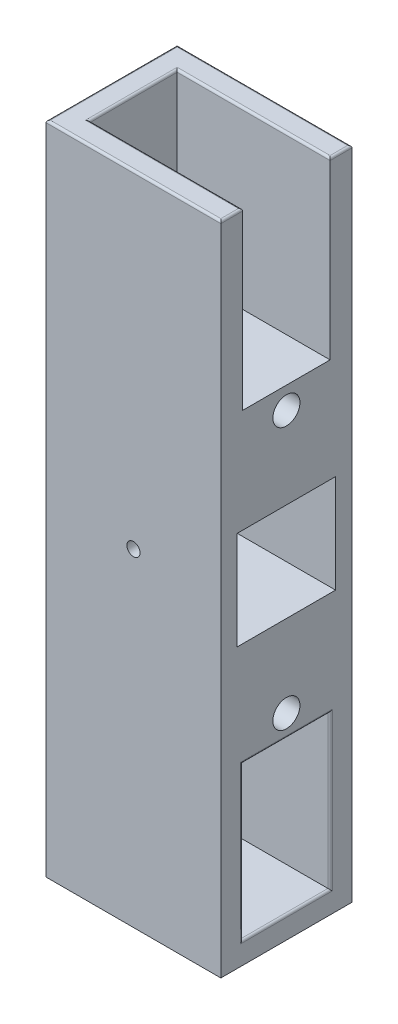
ISO-10303-21;
HEADER;
FILE_DESCRIPTION(('STEP AP214'),'2;1');
FILE_NAME('part.step','',(''),(''),'','','');
FILE_SCHEMA(('AUTOMOTIVE_DESIGN { 1 0 10303 214 1 1 1 1 }'));
ENDSEC;
DATA;
#1=APPLICATION_CONTEXT('core data for automotive mechanical design processes');
#2=APPLICATION_PROTOCOL_DEFINITION('international standard','automotive_design',2000,#1);
#3=PRODUCT_CONTEXT('',#1,'mechanical');
#4=PRODUCT('Part','Part','',(#3));
#5=PRODUCT_RELATED_PRODUCT_CATEGORY('part','',(#4));
#6=PRODUCT_DEFINITION_FORMATION('','',#4);
#7=PRODUCT_DEFINITION_CONTEXT('part definition',#1,'design');
#8=PRODUCT_DEFINITION('design','',#6,#7);
#9=PRODUCT_DEFINITION_SHAPE('','',#8);
#10=(LENGTH_UNIT() NAMED_UNIT(*) SI_UNIT(.MILLI.,.METRE.));
#11=(NAMED_UNIT(*) PLANE_ANGLE_UNIT() SI_UNIT($,.RADIAN.));
#12=(NAMED_UNIT(*) SI_UNIT($,.STERADIAN.) SOLID_ANGLE_UNIT());
#13=UNCERTAINTY_MEASURE_WITH_UNIT(LENGTH_MEASURE(1.E-05),#10,'distance_accuracy_value','');
#14=(GEOMETRIC_REPRESENTATION_CONTEXT(3) GLOBAL_UNCERTAINTY_ASSIGNED_CONTEXT((#13)) GLOBAL_UNIT_ASSIGNED_CONTEXT((#10,
#11,#12)) REPRESENTATION_CONTEXT('',''));
#15=CARTESIAN_POINT('',(0.,0.,0.));
#16=DIRECTION('',(0.,0.,1.));
#17=DIRECTION('',(1.,0.,0.));
#18=AXIS2_PLACEMENT_3D('',#15,#16,#17);
#19=CARTESIAN_POINT('',(20.,-75.,-15.));
#20=DIRECTION('',(1.,0.,0.));
#21=DIRECTION('',(0.,0.,-1.));
#22=AXIS2_PLACEMENT_3D('',#19,#20,#21);
#23=PLANE('',#22);
#24=DIRECTION('',(0.,1.,0.));
#25=VECTOR('',#24,1.);
#26=CARTESIAN_POINT('',(20.,-70.,-10.5));
#27=LINE('',#26,#25);
#28=CARTESIAN_POINT('',(20.,-34.5,-10.5));
#29=VERTEX_POINT('',#28);
#30=CARTESIAN_POINT('',(20.,-70.5,-10.5));
#31=VERTEX_POINT('',#30);
#32=EDGE_CURVE('E441',#29,#31,#27,.F.);
#33=ORIENTED_EDGE('',*,*,#32,.T.);
#34=DIRECTION('',(0.,0.,-1.));
#35=VECTOR('',#34,1.);
#36=CARTESIAN_POINT('',(20.,-70.5,10.));
#37=LINE('',#36,#35);
#38=CARTESIAN_POINT('',(20.,-70.5,10.5));
#39=VERTEX_POINT('',#38);
#40=EDGE_CURVE('E450',#31,#39,#37,.F.);
#41=ORIENTED_EDGE('',*,*,#40,.T.);
#42=DIRECTION('',(0.,-1.,0.));
#43=VECTOR('',#42,1.);
#44=CARTESIAN_POINT('',(20.,-35.,10.5));
#45=LINE('',#44,#43);
#46=CARTESIAN_POINT('',(20.,-34.5,10.5));
#47=VERTEX_POINT('',#46);
#48=EDGE_CURVE('E447',#39,#47,#45,.F.);
#49=ORIENTED_EDGE('',*,*,#48,.T.);
#50=DIRECTION('',(0.,0.,1.));
#51=VECTOR('',#50,1.);
#52=CARTESIAN_POINT('',(20.,-34.5,-10.));
#53=LINE('',#52,#51);
#54=EDGE_CURVE('E444',#47,#29,#53,.F.);
#55=ORIENTED_EDGE('',*,*,#54,.T.);
#56=EDGE_LOOP('',(#33,#41,#49,#55));
#57=FACE_BOUND('',#56,.T.);
#58=DIRECTION('',(0.,1.,0.));
#59=VECTOR('',#58,1.);
#60=CARTESIAN_POINT('',(20.,-75.,-15.));
#61=LINE('',#60,#59);
#62=CARTESIAN_POINT('',(20.,-75.,-15.));
#63=VERTEX_POINT('',#62);
#64=CARTESIAN_POINT('',(20.,74.5,-15.));
#65=VERTEX_POINT('',#64);
#66=EDGE_CURVE('E321',#63,#65,#61,.T.);
#67=ORIENTED_EDGE('',*,*,#66,.T.);
#68=DIRECTION('',(0.,0.,-1.));
#69=VECTOR('',#68,1.);
#70=CARTESIAN_POINT('',(20.,74.5,-15.));
#71=LINE('',#70,#69);
#72=CARTESIAN_POINT('',(20.,74.5,-10.));
#73=VERTEX_POINT('',#72);
#74=EDGE_CURVE('E390',#65,#73,#71,.F.);
#75=ORIENTED_EDGE('',*,*,#74,.T.);
#76=DIRECTION('',(0.,1.,0.));
#77=VECTOR('',#76,1.);
#78=CARTESIAN_POINT('',(20.,-75.,-10.));
#79=LINE('',#78,#77);
#80=CARTESIAN_POINT('',(20.,35.,-10.));
#81=VERTEX_POINT('',#80);
#82=EDGE_CURVE('E260',#81,#73,#79,.T.);
#83=ORIENTED_EDGE('',*,*,#82,.F.);
#84=DIRECTION('',(0.,0.,-1.));
#85=VECTOR('',#84,1.);
#86=CARTESIAN_POINT('',(20.,35.,-15.));
#87=LINE('',#86,#85);
#88=CARTESIAN_POINT('',(20.,35.,10.));
#89=VERTEX_POINT('',#88);
#90=EDGE_CURVE('E359',#89,#81,#87,.T.);
#91=ORIENTED_EDGE('',*,*,#90,.F.);
#92=DIRECTION('',(0.,-1.,0.));
#93=VECTOR('',#92,1.);
#94=CARTESIAN_POINT('',(20.,-75.,10.));
#95=LINE('',#94,#93);
#96=CARTESIAN_POINT('',(20.,74.5,10.));
#97=VERTEX_POINT('',#96);
#98=EDGE_CURVE('E254',#97,#89,#95,.T.);
#99=ORIENTED_EDGE('',*,*,#98,.F.);
#100=DIRECTION('',(0.,0.,-1.));
#101=VECTOR('',#100,1.);
#102=CARTESIAN_POINT('',(20.,74.5,-15.));
#103=LINE('',#102,#101);
#104=CARTESIAN_POINT('',(20.,74.5,15.));
#105=VERTEX_POINT('',#104);
#106=EDGE_CURVE('E387',#97,#105,#103,.F.);
#107=ORIENTED_EDGE('',*,*,#106,.T.);
#108=DIRECTION('',(0.,1.,0.));
#109=VECTOR('',#108,1.);
#110=CARTESIAN_POINT('',(20.,-75.,15.));
#111=LINE('',#110,#109);
#112=CARTESIAN_POINT('',(20.,-75.,15.));
#113=VERTEX_POINT('',#112);
#114=EDGE_CURVE('E322',#113,#105,#111,.T.);
#115=ORIENTED_EDGE('',*,*,#114,.F.);
#116=DIRECTION('',(0.,0.,-1.));
#117=VECTOR('',#116,1.);
#118=CARTESIAN_POINT('',(20.,-75.,-15.));
#119=LINE('',#118,#117);
#120=EDGE_CURVE('E305',#113,#63,#119,.T.);
#121=ORIENTED_EDGE('',*,*,#120,.T.);
#122=EDGE_LOOP('',(#67,#75,#83,#91,#99,#107,#115,#121));
#123=FACE_BOUND('',#122,.T.);
#124=CARTESIAN_POINT('',(20.,-30.,0.));
#125=DIRECTION('',(-1.,0.,0.));
#126=DIRECTION('',(0.,0.,-1.));
#127=AXIS2_PLACEMENT_3D('',#124,#125,#126);
#128=CIRCLE('',#127,3.1);
#129=CARTESIAN_POINT('',(20.,-30.,-3.1));
#130=VERTEX_POINT('',#129);
#131=EDGE_CURVE('E295',#130,#130,#128,.T.);
#132=ORIENTED_EDGE('',*,*,#131,.T.);
#133=EDGE_LOOP('',(#132));
#134=FACE_BOUND('',#133,.T.);
#135=CARTESIAN_POINT('',(20.,30.,0.));
#136=DIRECTION('',(1.,0.,0.));
#137=DIRECTION('',(0.,0.,-1.));
#138=AXIS2_PLACEMENT_3D('',#135,#136,#137);
#139=CIRCLE('',#138,3.1);
#140=CARTESIAN_POINT('',(20.,30.,-3.1));
#141=VERTEX_POINT('',#140);
#142=EDGE_CURVE('E300',#141,#141,#139,.T.);
#143=ORIENTED_EDGE('',*,*,#142,.F.);
#144=EDGE_LOOP('',(#143));
#145=FACE_BOUND('',#144,.T.);
#146=DIRECTION('',(0.,0.,-1.));
#147=VECTOR('',#146,1.);
#148=CARTESIAN_POINT('',(20.,11.25,-15.));
#149=LINE('',#148,#147);
#150=CARTESIAN_POINT('',(20.,11.25,11.25));
#151=VERTEX_POINT('',#150);
#152=CARTESIAN_POINT('',(20.,11.25,-11.25));
#153=VERTEX_POINT('',#152);
#154=EDGE_CURVE('E287',#151,#153,#149,.T.);
#155=ORIENTED_EDGE('',*,*,#154,.T.);
#156=DIRECTION('',(0.,-1.,0.));
#157=VECTOR('',#156,1.);
#158=CARTESIAN_POINT('',(20.,-75.,-11.25));
#159=LINE('',#158,#157);
#160=CARTESIAN_POINT('',(20.,-11.25,-11.25));
#161=VERTEX_POINT('',#160);
#162=EDGE_CURVE('E291',#153,#161,#159,.T.);
#163=ORIENTED_EDGE('',*,*,#162,.T.);
#164=DIRECTION('',(0.,0.,1.));
#165=VECTOR('',#164,1.);
#166=CARTESIAN_POINT('',(20.,-11.25,-15.));
#167=LINE('',#166,#165);
#168=CARTESIAN_POINT('',(20.,-11.25,11.25));
#169=VERTEX_POINT('',#168);
#170=EDGE_CURVE('E279',#161,#169,#167,.T.);
#171=ORIENTED_EDGE('',*,*,#170,.T.);
#172=DIRECTION('',(0.,1.,0.));
#173=VECTOR('',#172,1.);
#174=CARTESIAN_POINT('',(20.,-75.,11.25));
#175=LINE('',#174,#173);
#176=EDGE_CURVE('E283',#169,#151,#175,.T.);
#177=ORIENTED_EDGE('',*,*,#176,.T.);
#178=EDGE_LOOP('',(#155,#163,#171,#177));
#179=FACE_BOUND('',#178,.T.);
#180=ADVANCED_FACE('F39',(#57,#123,#134,#145,#179),#23,.T.);
#181=CARTESIAN_POINT('',(-20.,-75.,-15.));
#182=DIRECTION('',(-1.,0.,0.));
#183=DIRECTION('',(0.,0.,1.));
#184=AXIS2_PLACEMENT_3D('',#181,#182,#183);
#185=PLANE('',#184);
#186=CARTESIAN_POINT('',(-20.,-30.,0.));
#187=DIRECTION('',(-1.,0.,0.));
#188=DIRECTION('',(0.,0.,1.));
#189=AXIS2_PLACEMENT_3D('',#186,#187,#188);
#190=CIRCLE('',#189,3.1);
#191=CARTESIAN_POINT('',(-20.,-30.,3.1));
#192=VERTEX_POINT('',#191);
#193=EDGE_CURVE('E299',#192,#192,#190,.F.);
#194=ORIENTED_EDGE('',*,*,#193,.T.);
#195=EDGE_LOOP('',(#194));
#196=FACE_BOUND('',#195,.T.);
#197=CARTESIAN_POINT('',(-20.,30.,0.));
#198=DIRECTION('',(-1.,0.,0.));
#199=DIRECTION('',(0.,0.,1.));
#200=AXIS2_PLACEMENT_3D('',#197,#198,#199);
#201=CIRCLE('',#200,3.1);
#202=CARTESIAN_POINT('',(-20.,30.,3.1));
#203=VERTEX_POINT('',#202);
#204=EDGE_CURVE('E304',#203,#203,#201,.T.);
#205=ORIENTED_EDGE('',*,*,#204,.F.);
#206=EDGE_LOOP('',(#205));
#207=FACE_BOUND('',#206,.T.);
#208=DIRECTION('',(0.,1.,0.));
#209=VECTOR('',#208,1.);
#210=CARTESIAN_POINT('',(-20.,-75.,15.));
#211=LINE('',#210,#209);
#212=CARTESIAN_POINT('',(-20.,-75.,15.));
#213=VERTEX_POINT('',#212);
#214=CARTESIAN_POINT('',(-20.,74.5,15.));
#215=VERTEX_POINT('',#214);
#216=EDGE_CURVE('E327',#213,#215,#211,.T.);
#217=ORIENTED_EDGE('',*,*,#216,.T.);
#218=DIRECTION('',(0.,0.,1.));
#219=VECTOR('',#218,1.);
#220=CARTESIAN_POINT('',(-20.,74.5,-15.));
#221=LINE('',#220,#219);
#222=CARTESIAN_POINT('',(-20.,74.5,-15.));
#223=VERTEX_POINT('',#222);
#224=EDGE_CURVE('E406',#215,#223,#221,.F.);
#225=ORIENTED_EDGE('',*,*,#224,.T.);
#226=DIRECTION('',(0.,1.,0.));
#227=VECTOR('',#226,1.);
#228=CARTESIAN_POINT('',(-20.,-75.,-15.));
#229=LINE('',#228,#227);
#230=CARTESIAN_POINT('',(-20.,-75.,-15.));
#231=VERTEX_POINT('',#230);
#232=EDGE_CURVE('E331',#231,#223,#229,.T.);
#233=ORIENTED_EDGE('',*,*,#232,.F.);
#234=DIRECTION('',(0.,0.,1.));
#235=VECTOR('',#234,1.);
#236=CARTESIAN_POINT('',(-20.,-75.,-15.));
#237=LINE('',#236,#235);
#238=EDGE_CURVE('E313',#231,#213,#237,.T.);
#239=ORIENTED_EDGE('',*,*,#238,.T.);
#240=EDGE_LOOP('',(#217,#225,#233,#239));
#241=FACE_BOUND('',#240,.T.);
#242=DIRECTION('',(0.,0.,-1.));
#243=VECTOR('',#242,1.);
#244=CARTESIAN_POINT('',(-20.,-11.25,-15.));
#245=LINE('',#244,#243);
#246=CARTESIAN_POINT('',(-20.,-11.25,11.25));
#247=VERTEX_POINT('',#246);
#248=CARTESIAN_POINT('',(-20.,-11.25,-11.25));
#249=VERTEX_POINT('',#248);
#250=EDGE_CURVE('E326',#247,#249,#245,.T.);
#251=ORIENTED_EDGE('',*,*,#250,.T.);
#252=DIRECTION('',(0.,1.,0.));
#253=VECTOR('',#252,1.);
#254=CARTESIAN_POINT('',(-20.,-75.,-11.25));
#255=LINE('',#254,#253);
#256=CARTESIAN_POINT('',(-20.,11.25,-11.25));
#257=VERTEX_POINT('',#256);
#258=EDGE_CURVE('E355',#249,#257,#255,.T.);
#259=ORIENTED_EDGE('',*,*,#258,.T.);
#260=DIRECTION('',(0.,0.,1.));
#261=VECTOR('',#260,1.);
#262=CARTESIAN_POINT('',(-20.,11.25,-15.));
#263=LINE('',#262,#261);
#264=CARTESIAN_POINT('',(-20.,11.25,11.25));
#265=VERTEX_POINT('',#264);
#266=EDGE_CURVE('E351',#257,#265,#263,.T.);
#267=ORIENTED_EDGE('',*,*,#266,.T.);
#268=DIRECTION('',(0.,-1.,0.));
#269=VECTOR('',#268,1.);
#270=CARTESIAN_POINT('',(-20.,-75.,11.25));
#271=LINE('',#270,#269);
#272=EDGE_CURVE('E347',#265,#247,#271,.T.);
#273=ORIENTED_EDGE('',*,*,#272,.T.);
#274=EDGE_LOOP('',(#251,#259,#267,#273));
#275=FACE_BOUND('',#274,.T.);
#276=ADVANCED_FACE('F499',(#196,#207,#241,#275),#185,.T.);
#277=CARTESIAN_POINT('',(-20.,-75.,15.));
#278=DIRECTION('',(0.,0.,1.));
#279=DIRECTION('',(1.,0.,0.));
#280=AXIS2_PLACEMENT_3D('',#277,#278,#279);
#281=PLANE('',#280);
#282=CARTESIAN_POINT('',(0.,0.,15.));
#283=DIRECTION('',(0.,0.,1.));
#284=DIRECTION('',(1.,0.,0.));
#285=AXIS2_PLACEMENT_3D('',#282,#283,#284);
#286=CIRCLE('',#285,1.5);
#287=CARTESIAN_POINT('',(1.5,0.,15.));
#288=VERTEX_POINT('',#287);
#289=EDGE_CURVE('E223',#288,#288,#286,.F.);
#290=ORIENTED_EDGE('',*,*,#289,.T.);
#291=EDGE_LOOP('',(#290));
#292=FACE_BOUND('',#291,.T.);
#293=ORIENTED_EDGE('',*,*,#114,.T.);
#294=DIRECTION('',(1.,0.,0.));
#295=VECTOR('',#294,1.);
#296=CARTESIAN_POINT('',(-20.,74.5,15.));
#297=LINE('',#296,#295);
#298=EDGE_CURVE('E409',#105,#215,#297,.F.);
#299=ORIENTED_EDGE('',*,*,#298,.T.);
#300=ORIENTED_EDGE('',*,*,#216,.F.);
#301=DIRECTION('',(1.,0.,0.));
#302=VECTOR('',#301,1.);
#303=CARTESIAN_POINT('',(-20.,-75.,15.));
#304=LINE('',#303,#302);
#305=EDGE_CURVE('E317',#213,#113,#304,.T.);
#306=ORIENTED_EDGE('',*,*,#305,.T.);
#307=EDGE_LOOP('',(#293,#299,#300,#306));
#308=FACE_BOUND('',#307,.T.);
#309=ADVANCED_FACE('F504',(#292,#308),#281,.T.);
#310=CARTESIAN_POINT('',(-20.,-75.,-15.));
#311=DIRECTION('',(0.,0.,-1.));
#312=DIRECTION('',(-1.,0.,0.));
#313=AXIS2_PLACEMENT_3D('',#310,#311,#312);
#314=PLANE('',#313);
#315=CARTESIAN_POINT('',(0.,0.,-15.));
#316=DIRECTION('',(0.,0.,-1.));
#317=DIRECTION('',(-1.,0.,0.));
#318=AXIS2_PLACEMENT_3D('',#315,#316,#317);
#319=CIRCLE('',#318,1.5);
#320=CARTESIAN_POINT('',(-1.5,0.,-15.));
#321=VERTEX_POINT('',#320);
#322=EDGE_CURVE('E808',#321,#321,#319,.F.);
#323=ORIENTED_EDGE('',*,*,#322,.T.);
#324=EDGE_LOOP('',(#323));
#325=FACE_BOUND('',#324,.T.);
#326=ORIENTED_EDGE('',*,*,#232,.T.);
#327=DIRECTION('',(-1.,0.,0.));
#328=VECTOR('',#327,1.);
#329=CARTESIAN_POINT('',(-20.,74.5,-15.));
#330=LINE('',#329,#328);
#331=EDGE_CURVE('E403',#223,#65,#330,.F.);
#332=ORIENTED_EDGE('',*,*,#331,.T.);
#333=ORIENTED_EDGE('',*,*,#66,.F.);
#334=DIRECTION('',(-1.,0.,0.));
#335=VECTOR('',#334,1.);
#336=CARTESIAN_POINT('',(-20.,-75.,-15.));
#337=LINE('',#336,#335);
#338=EDGE_CURVE('E309',#63,#231,#337,.T.);
#339=ORIENTED_EDGE('',*,*,#338,.T.);
#340=EDGE_LOOP('',(#326,#332,#333,#339));
#341=FACE_BOUND('',#340,.T.);
#342=ADVANCED_FACE('F509',(#325,#341),#314,.T.);
#343=CARTESIAN_POINT('',(0.,-75.,0.));
#344=DIRECTION('',(0.,1.,0.));
#345=DIRECTION('',(0.,0.,1.));
#346=AXIS2_PLACEMENT_3D('',#343,#344,#345);
#347=PLANE('',#346);
#348=ORIENTED_EDGE('',*,*,#120,.F.);
#349=ORIENTED_EDGE('',*,*,#305,.F.);
#350=ORIENTED_EDGE('',*,*,#238,.F.);
#351=ORIENTED_EDGE('',*,*,#338,.F.);
#352=EDGE_LOOP('',(#348,#349,#350,#351));
#353=FACE_BOUND('',#352,.T.);
#354=ADVANCED_FACE('F724',(#353),#347,.F.);
#355=CARTESIAN_POINT('',(0.,75.,0.));
#356=DIRECTION('',(0.,1.,0.));
#357=DIRECTION('',(0.,0.,1.));
#358=AXIS2_PLACEMENT_3D('',#355,#356,#357);
#359=PLANE('',#358);
#360=DIRECTION('',(-1.,0.,0.));
#361=VECTOR('',#360,1.);
#362=CARTESIAN_POINT('',(20.,75.,-10.5));
#363=LINE('',#362,#361);
#364=CARTESIAN_POINT('',(-15.5,75.,-10.5));
#365=VERTEX_POINT('',#364);
#366=CARTESIAN_POINT('',(19.5,75.,-10.5));
#367=VERTEX_POINT('',#366);
#368=EDGE_CURVE('E380',#365,#367,#363,.F.);
#369=ORIENTED_EDGE('',*,*,#368,.T.);
#370=DIRECTION('',(0.,0.,-1.));
#371=VECTOR('',#370,1.);
#372=CARTESIAN_POINT('',(19.5,75.,0.));
#373=LINE('',#372,#371);
#374=CARTESIAN_POINT('',(19.5,75.,-14.5));
#375=VERTEX_POINT('',#374);
#376=EDGE_CURVE('E383',#367,#375,#373,.T.);
#377=ORIENTED_EDGE('',*,*,#376,.T.);
#378=DIRECTION('',(-1.,0.,0.));
#379=VECTOR('',#378,1.);
#380=CARTESIAN_POINT('',(0.,75.,-14.5));
#381=LINE('',#380,#379);
#382=CARTESIAN_POINT('',(-19.5,75.,-14.5));
#383=VERTEX_POINT('',#382);
#384=EDGE_CURVE('E368',#375,#383,#381,.T.);
#385=ORIENTED_EDGE('',*,*,#384,.T.);
#386=DIRECTION('',(0.,0.,1.));
#387=VECTOR('',#386,1.);
#388=CARTESIAN_POINT('',(-19.5,75.,0.));
#389=LINE('',#388,#387);
#390=CARTESIAN_POINT('',(-19.5,75.,14.5));
#391=VERTEX_POINT('',#390);
#392=EDGE_CURVE('E365',#383,#391,#389,.T.);
#393=ORIENTED_EDGE('',*,*,#392,.T.);
#394=DIRECTION('',(1.,0.,0.));
#395=VECTOR('',#394,1.);
#396=CARTESIAN_POINT('',(0.,75.,14.5));
#397=LINE('',#396,#395);
#398=CARTESIAN_POINT('',(19.5,75.,14.5));
#399=VERTEX_POINT('',#398);
#400=EDGE_CURVE('E362',#391,#399,#397,.T.);
#401=ORIENTED_EDGE('',*,*,#400,.T.);
#402=DIRECTION('',(0.,0.,-1.));
#403=VECTOR('',#402,1.);
#404=CARTESIAN_POINT('',(19.5,75.,0.));
#405=LINE('',#404,#403);
#406=CARTESIAN_POINT('',(19.5,75.,10.5));
#407=VERTEX_POINT('',#406);
#408=EDGE_CURVE('E371',#399,#407,#405,.T.);
#409=ORIENTED_EDGE('',*,*,#408,.T.);
#410=DIRECTION('',(1.,0.,0.));
#411=VECTOR('',#410,1.);
#412=CARTESIAN_POINT('',(-15.,75.,10.5));
#413=LINE('',#412,#411);
#414=CARTESIAN_POINT('',(-15.5,75.,10.5));
#415=VERTEX_POINT('',#414);
#416=EDGE_CURVE('E374',#407,#415,#413,.F.);
#417=ORIENTED_EDGE('',*,*,#416,.T.);
#418=DIRECTION('',(0.,0.,1.));
#419=VECTOR('',#418,1.);
#420=CARTESIAN_POINT('',(-15.5,75.,-10.));
#421=LINE('',#420,#419);
#422=EDGE_CURVE('E377',#415,#365,#421,.F.);
#423=ORIENTED_EDGE('',*,*,#422,.T.);
#424=EDGE_LOOP('',(#369,#377,#385,#393,#401,#409,#417,#423));
#425=FACE_BOUND('',#424,.T.);
#426=ADVANCED_FACE('F716',(#425),#359,.T.);
#427=CARTESIAN_POINT('',(-130.,30.,0.));
#428=DIRECTION('',(1.,0.,0.));
#429=DIRECTION('',(0.,0.,-1.));
#430=AXIS2_PLACEMENT_3D('',#427,#428,#429);
#431=CYLINDRICAL_SURFACE('',#430,3.1);
#432=ORIENTED_EDGE('',*,*,#204,.T.);
#433=EDGE_LOOP('',(#432));
#434=FACE_BOUND('',#433,.T.);
#435=ORIENTED_EDGE('',*,*,#142,.T.);
#436=EDGE_LOOP('',(#435));
#437=FACE_BOUND('',#436,.T.);
#438=ADVANCED_FACE('F709',(#434,#437),#431,.F.);
#439=CARTESIAN_POINT('',(-130.,-30.,0.));
#440=DIRECTION('',(1.,0.,0.));
#441=DIRECTION('',(0.,0.,-1.));
#442=AXIS2_PLACEMENT_3D('',#439,#440,#441);
#443=CYLINDRICAL_SURFACE('',#442,3.1);
#444=ORIENTED_EDGE('',*,*,#193,.F.);
#445=EDGE_LOOP('',(#444));
#446=FACE_BOUND('',#445,.T.);
#447=ORIENTED_EDGE('',*,*,#131,.F.);
#448=EDGE_LOOP('',(#447));
#449=FACE_BOUND('',#448,.T.);
#450=ADVANCED_FACE('F634',(#446,#449),#443,.F.);
#451=CARTESIAN_POINT('',(150.,11.25,-11.25));
#452=DIRECTION('',(0.,0.,1.));
#453=DIRECTION('',(0.,-1.,0.));
#454=AXIS2_PLACEMENT_3D('',#451,#452,#453);
#455=PLANE('',#454);
#456=CARTESIAN_POINT('',(0.,0.,-11.25));
#457=DIRECTION('',(0.,0.,1.));
#458=DIRECTION('',(0.,-1.,0.));
#459=AXIS2_PLACEMENT_3D('',#456,#457,#458);
#460=CIRCLE('',#459,1.5);
#461=CARTESIAN_POINT('',(0.,-1.5,-11.25));
#462=VERTEX_POINT('',#461);
#463=EDGE_CURVE('E811',#462,#462,#460,.F.);
#464=ORIENTED_EDGE('',*,*,#463,.T.);
#465=EDGE_LOOP('',(#464));
#466=FACE_BOUND('',#465,.T.);
#467=DIRECTION('',(-1.,0.,0.));
#468=VECTOR('',#467,1.);
#469=CARTESIAN_POINT('',(150.,11.25,-11.25));
#470=LINE('',#469,#468);
#471=EDGE_CURVE('E275',#153,#257,#470,.T.);
#472=ORIENTED_EDGE('',*,*,#471,.T.);
#473=ORIENTED_EDGE('',*,*,#258,.F.);
#474=DIRECTION('',(-1.,0.,0.));
#475=VECTOR('',#474,1.);
#476=CARTESIAN_POINT('',(150.,-11.25,-11.25));
#477=LINE('',#476,#475);
#478=EDGE_CURVE('E264',#161,#249,#477,.T.);
#479=ORIENTED_EDGE('',*,*,#478,.F.);
#480=ORIENTED_EDGE('',*,*,#162,.F.);
#481=EDGE_LOOP('',(#472,#473,#479,#480));
#482=FACE_BOUND('',#481,.T.);
#483=ADVANCED_FACE('F627',(#466,#482),#455,.T.);
#484=CARTESIAN_POINT('',(150.,11.25,11.25));
#485=DIRECTION('',(0.,-1.,0.));
#486=DIRECTION('',(0.,0.,-1.));
#487=AXIS2_PLACEMENT_3D('',#484,#485,#486);
#488=PLANE('',#487);
#489=DIRECTION('',(-1.,0.,0.));
#490=VECTOR('',#489,1.);
#491=CARTESIAN_POINT('',(150.,11.25,11.25));
#492=LINE('',#491,#490);
#493=EDGE_CURVE('E271',#151,#265,#492,.T.);
#494=ORIENTED_EDGE('',*,*,#493,.T.);
#495=ORIENTED_EDGE('',*,*,#266,.F.);
#496=ORIENTED_EDGE('',*,*,#471,.F.);
#497=ORIENTED_EDGE('',*,*,#154,.F.);
#498=EDGE_LOOP('',(#494,#495,#496,#497));
#499=FACE_BOUND('',#498,.T.);
#500=ADVANCED_FACE('F633',(#499),#488,.T.);
#501=CARTESIAN_POINT('',(150.,11.25,11.25));
#502=DIRECTION('',(0.,0.,-1.));
#503=DIRECTION('',(0.,1.,0.));
#504=AXIS2_PLACEMENT_3D('',#501,#502,#503);
#505=PLANE('',#504);
#506=CARTESIAN_POINT('',(0.,0.,11.25));
#507=DIRECTION('',(0.,0.,-1.));
#508=DIRECTION('',(0.,1.,0.));
#509=AXIS2_PLACEMENT_3D('',#506,#507,#508);
#510=CIRCLE('',#509,1.5);
#511=CARTESIAN_POINT('',(0.,1.5,11.25));
#512=VERTEX_POINT('',#511);
#513=EDGE_CURVE('E43',#512,#512,#510,.F.);
#514=ORIENTED_EDGE('',*,*,#513,.T.);
#515=EDGE_LOOP('',(#514));
#516=FACE_BOUND('',#515,.T.);
#517=DIRECTION('',(-1.,0.,0.));
#518=VECTOR('',#517,1.);
#519=CARTESIAN_POINT('',(150.,-11.25,11.25));
#520=LINE('',#519,#518);
#521=EDGE_CURVE('E267',#169,#247,#520,.T.);
#522=ORIENTED_EDGE('',*,*,#521,.T.);
#523=ORIENTED_EDGE('',*,*,#272,.F.);
#524=ORIENTED_EDGE('',*,*,#493,.F.);
#525=ORIENTED_EDGE('',*,*,#176,.F.);
#526=EDGE_LOOP('',(#522,#523,#524,#525));
#527=FACE_BOUND('',#526,.T.);
#528=ADVANCED_FACE('F645',(#516,#527),#505,.T.);
#529=CARTESIAN_POINT('',(150.,-11.25,11.25));
#530=DIRECTION('',(0.,1.,0.));
#531=DIRECTION('',(0.,0.,1.));
#532=AXIS2_PLACEMENT_3D('',#529,#530,#531);
#533=PLANE('',#532);
#534=ORIENTED_EDGE('',*,*,#478,.T.);
#535=ORIENTED_EDGE('',*,*,#250,.F.);
#536=ORIENTED_EDGE('',*,*,#521,.F.);
#537=ORIENTED_EDGE('',*,*,#170,.F.);
#538=EDGE_LOOP('',(#534,#535,#536,#537));
#539=FACE_BOUND('',#538,.T.);
#540=ADVANCED_FACE('F655',(#539),#533,.T.);
#541=CARTESIAN_POINT('',(-15.,35.,10.));
#542=DIRECTION('',(-1.,0.,0.));
#543=DIRECTION('',(0.,0.,1.));
#544=AXIS2_PLACEMENT_3D('',#541,#542,#543);
#545=PLANE('',#544);
#546=DIRECTION('',(0.,1.,0.));
#547=VECTOR('',#546,1.);
#548=CARTESIAN_POINT('',(-15.,35.,-10.));
#549=LINE('',#548,#547);
#550=CARTESIAN_POINT('',(-15.,35.,-10.));
#551=VERTEX_POINT('',#550);
#552=CARTESIAN_POINT('',(-15.,74.5,-10.));
#553=VERTEX_POINT('',#552);
#554=EDGE_CURVE('E250',#551,#553,#549,.T.);
#555=ORIENTED_EDGE('',*,*,#554,.T.);
#556=DIRECTION('',(0.,0.,1.));
#557=VECTOR('',#556,1.);
#558=CARTESIAN_POINT('',(-15.,74.5,10.));
#559=LINE('',#558,#557);
#560=CARTESIAN_POINT('',(-15.,74.5,10.));
#561=VERTEX_POINT('',#560);
#562=EDGE_CURVE('E397',#553,#561,#559,.T.);
#563=ORIENTED_EDGE('',*,*,#562,.T.);
#564=DIRECTION('',(0.,1.,0.));
#565=VECTOR('',#564,1.);
#566=CARTESIAN_POINT('',(-15.,35.,10.));
#567=LINE('',#566,#565);
#568=CARTESIAN_POINT('',(-15.,35.,10.));
#569=VERTEX_POINT('',#568);
#570=EDGE_CURVE('E249',#569,#561,#567,.T.);
#571=ORIENTED_EDGE('',*,*,#570,.F.);
#572=DIRECTION('',(0.,0.,1.));
#573=VECTOR('',#572,1.);
#574=CARTESIAN_POINT('',(-15.,35.,10.));
#575=LINE('',#574,#573);
#576=EDGE_CURVE('E233',#551,#569,#575,.T.);
#577=ORIENTED_EDGE('',*,*,#576,.F.);
#578=EDGE_LOOP('',(#555,#563,#571,#577));
#579=FACE_BOUND('',#578,.T.);
#580=ADVANCED_FACE('F664',(#579),#545,.F.);
#581=CARTESIAN_POINT('',(-15.,35.,-10.));
#582=DIRECTION('',(0.,0.,-1.));
#583=DIRECTION('',(-1.,0.,0.));
#584=AXIS2_PLACEMENT_3D('',#581,#582,#583);
#585=PLANE('',#584);
#586=ORIENTED_EDGE('',*,*,#82,.T.);
#587=DIRECTION('',(-1.,0.,0.));
#588=VECTOR('',#587,1.);
#589=CARTESIAN_POINT('',(-15.,74.5,-10.));
#590=LINE('',#589,#588);
#591=EDGE_CURVE('E394',#73,#553,#590,.T.);
#592=ORIENTED_EDGE('',*,*,#591,.T.);
#593=ORIENTED_EDGE('',*,*,#554,.F.);
#594=DIRECTION('',(-1.,0.,0.));
#595=VECTOR('',#594,1.);
#596=CARTESIAN_POINT('',(-15.,35.,-10.));
#597=LINE('',#596,#595);
#598=EDGE_CURVE('E246',#81,#551,#597,.T.);
#599=ORIENTED_EDGE('',*,*,#598,.F.);
#600=EDGE_LOOP('',(#586,#592,#593,#599));
#601=FACE_BOUND('',#600,.T.);
#602=ADVANCED_FACE('F673',(#601),#585,.F.);
#603=CARTESIAN_POINT('',(-15.,35.,10.));
#604=DIRECTION('',(0.,0.,1.));
#605=DIRECTION('',(1.,0.,0.));
#606=AXIS2_PLACEMENT_3D('',#603,#604,#605);
#607=PLANE('',#606);
#608=ORIENTED_EDGE('',*,*,#570,.T.);
#609=DIRECTION('',(1.,0.,0.));
#610=VECTOR('',#609,1.);
#611=CARTESIAN_POINT('',(20.,74.5,10.));
#612=LINE('',#611,#610);
#613=EDGE_CURVE('E400',#561,#97,#612,.T.);
#614=ORIENTED_EDGE('',*,*,#613,.T.);
#615=ORIENTED_EDGE('',*,*,#98,.T.);
#616=DIRECTION('',(1.,0.,0.));
#617=VECTOR('',#616,1.);
#618=CARTESIAN_POINT('',(-15.,35.,10.));
#619=LINE('',#618,#617);
#620=EDGE_CURVE('E242',#569,#89,#619,.T.);
#621=ORIENTED_EDGE('',*,*,#620,.F.);
#622=EDGE_LOOP('',(#608,#614,#615,#621));
#623=FACE_BOUND('',#622,.T.);
#624=ADVANCED_FACE('F683',(#623),#607,.F.);
#625=CARTESIAN_POINT('',(0.,35.,0.));
#626=DIRECTION('',(0.,-1.,0.));
#627=DIRECTION('',(0.,0.,-1.));
#628=AXIS2_PLACEMENT_3D('',#625,#626,#627);
#629=PLANE('',#628);
#630=ORIENTED_EDGE('',*,*,#90,.T.);
#631=ORIENTED_EDGE('',*,*,#598,.T.);
#632=ORIENTED_EDGE('',*,*,#576,.T.);
#633=ORIENTED_EDGE('',*,*,#620,.T.);
#634=EDGE_LOOP('',(#630,#631,#632,#633));
#635=FACE_BOUND('',#634,.T.);
#636=ADVANCED_FACE('F495',(#635),#629,.F.);
#637=CARTESIAN_POINT('',(-15.,-70.,10.));
#638=DIRECTION('',(0.,0.,1.));
#639=DIRECTION('',(1.,0.,0.));
#640=AXIS2_PLACEMENT_3D('',#637,#638,#639);
#641=PLANE('',#640);
#642=DIRECTION('',(1.,0.,0.));
#643=VECTOR('',#642,1.);
#644=CARTESIAN_POINT('',(-15.,-35.,10.));
#645=LINE('',#644,#643);
#646=CARTESIAN_POINT('',(-15.,-35.,10.));
#647=VERTEX_POINT('',#646);
#648=CARTESIAN_POINT('',(19.5,-35.,10.));
#649=VERTEX_POINT('',#648);
#650=EDGE_CURVE('E230',#647,#649,#645,.T.);
#651=ORIENTED_EDGE('',*,*,#650,.T.);
#652=DIRECTION('',(0.,-1.,0.));
#653=VECTOR('',#652,1.);
#654=CARTESIAN_POINT('',(19.5,-70.,10.));
#655=LINE('',#654,#653);
#656=CARTESIAN_POINT('',(19.5,-70.,10.));
#657=VERTEX_POINT('',#656);
#658=EDGE_CURVE('E196',#649,#657,#655,.T.);
#659=ORIENTED_EDGE('',*,*,#658,.T.);
#660=DIRECTION('',(1.,0.,0.));
#661=VECTOR('',#660,1.);
#662=CARTESIAN_POINT('',(-15.,-70.,10.));
#663=LINE('',#662,#661);
#664=CARTESIAN_POINT('',(-15.,-70.,10.));
#665=VERTEX_POINT('',#664);
#666=EDGE_CURVE('E189',#665,#657,#663,.T.);
#667=ORIENTED_EDGE('',*,*,#666,.F.);
#668=DIRECTION('',(0.,-1.,0.));
#669=VECTOR('',#668,1.);
#670=CARTESIAN_POINT('',(-15.,-70.,10.));
#671=LINE('',#670,#669);
#672=EDGE_CURVE('E193',#647,#665,#671,.T.);
#673=ORIENTED_EDGE('',*,*,#672,.F.);
#674=EDGE_LOOP('',(#651,#659,#667,#673));
#675=FACE_BOUND('',#674,.T.);
#676=ADVANCED_FACE('F191',(#675),#641,.F.);
#677=CARTESIAN_POINT('',(-15.,-35.,10.));
#678=DIRECTION('',(0.,1.,0.));
#679=DIRECTION('',(0.,0.,1.));
#680=AXIS2_PLACEMENT_3D('',#677,#678,#679);
#681=PLANE('',#680);
#682=DIRECTION('',(1.,0.,0.));
#683=VECTOR('',#682,1.);
#684=CARTESIAN_POINT('',(-15.,-35.,-9.99999999999999));
#685=LINE('',#684,#683);
#686=CARTESIAN_POINT('',(-15.,-35.,-9.99999999999999));
#687=VERTEX_POINT('',#686);
#688=CARTESIAN_POINT('',(19.5,-35.,-10.));
#689=VERTEX_POINT('',#688);
#690=EDGE_CURVE('E234',#687,#689,#685,.T.);
#691=ORIENTED_EDGE('',*,*,#690,.T.);
#692=DIRECTION('',(0.,0.,1.));
#693=VECTOR('',#692,1.);
#694=CARTESIAN_POINT('',(19.5,-35.,10.));
#695=LINE('',#694,#693);
#696=EDGE_CURVE('E49',#689,#649,#695,.T.);
#697=ORIENTED_EDGE('',*,*,#696,.T.);
#698=ORIENTED_EDGE('',*,*,#650,.F.);
#699=DIRECTION('',(0.,0.,1.));
#700=VECTOR('',#699,1.);
#701=CARTESIAN_POINT('',(-15.,-35.,10.));
#702=LINE('',#701,#700);
#703=EDGE_CURVE('E202',#687,#647,#702,.T.);
#704=ORIENTED_EDGE('',*,*,#703,.F.);
#705=EDGE_LOOP('',(#691,#697,#698,#704));
#706=FACE_BOUND('',#705,.T.);
#707=ADVANCED_FACE('F487',(#706),#681,.F.);
#708=CARTESIAN_POINT('',(-15.,-70.,-9.99999999999999));
#709=DIRECTION('',(0.,0.,-1.));
#710=DIRECTION('',(-1.,0.,0.));
#711=AXIS2_PLACEMENT_3D('',#708,#709,#710);
#712=PLANE('',#711);
#713=DIRECTION('',(1.,0.,0.));
#714=VECTOR('',#713,1.);
#715=CARTESIAN_POINT('',(-15.,-70.,-9.99999999999999));
#716=LINE('',#715,#714);
#717=CARTESIAN_POINT('',(-15.,-70.,-9.99999999999999));
#718=VERTEX_POINT('',#717);
#719=CARTESIAN_POINT('',(19.5,-70.,-10.));
#720=VERTEX_POINT('',#719);
#721=EDGE_CURVE('E201',#718,#720,#716,.T.);
#722=ORIENTED_EDGE('',*,*,#721,.T.);
#723=DIRECTION('',(0.,1.,0.));
#724=VECTOR('',#723,1.);
#725=CARTESIAN_POINT('',(19.5,-35.,-10.));
#726=LINE('',#725,#724);
#727=EDGE_CURVE('E11',#720,#689,#726,.T.);
#728=ORIENTED_EDGE('',*,*,#727,.T.);
#729=ORIENTED_EDGE('',*,*,#690,.F.);
#730=DIRECTION('',(0.,1.,0.));
#731=VECTOR('',#730,1.);
#732=CARTESIAN_POINT('',(-15.,-70.,-9.99999999999999));
#733=LINE('',#732,#731);
#734=EDGE_CURVE('E211',#718,#687,#733,.T.);
#735=ORIENTED_EDGE('',*,*,#734,.F.);
#736=EDGE_LOOP('',(#722,#728,#729,#735));
#737=FACE_BOUND('',#736,.T.);
#738=ADVANCED_FACE('F486',(#737),#712,.F.);
#739=CARTESIAN_POINT('',(-15.,-70.,10.));
#740=DIRECTION('',(0.,-1.,0.));
#741=DIRECTION('',(0.,0.,-1.));
#742=AXIS2_PLACEMENT_3D('',#739,#740,#741);
#743=PLANE('',#742);
#744=ORIENTED_EDGE('',*,*,#666,.T.);
#745=DIRECTION('',(0.,0.,-1.));
#746=VECTOR('',#745,1.);
#747=CARTESIAN_POINT('',(19.5,-70.,-10.));
#748=LINE('',#747,#746);
#749=EDGE_CURVE('E412',#657,#720,#748,.T.);
#750=ORIENTED_EDGE('',*,*,#749,.T.);
#751=ORIENTED_EDGE('',*,*,#721,.F.);
#752=DIRECTION('',(0.,0.,-1.));
#753=VECTOR('',#752,1.);
#754=CARTESIAN_POINT('',(-15.,-70.,10.));
#755=LINE('',#754,#753);
#756=EDGE_CURVE('E205',#665,#718,#755,.T.);
#757=ORIENTED_EDGE('',*,*,#756,.F.);
#758=EDGE_LOOP('',(#744,#750,#751,#757));
#759=FACE_BOUND('',#758,.T.);
#760=ADVANCED_FACE('F206',(#759),#743,.F.);
#761=CARTESIAN_POINT('',(-15.,0.,0.));
#762=DIRECTION('',(-1.,0.,0.));
#763=DIRECTION('',(0.,0.,1.));
#764=AXIS2_PLACEMENT_3D('',#761,#762,#763);
#765=PLANE('',#764);
#766=ORIENTED_EDGE('',*,*,#672,.T.);
#767=ORIENTED_EDGE('',*,*,#756,.T.);
#768=ORIENTED_EDGE('',*,*,#734,.T.);
#769=ORIENTED_EDGE('',*,*,#703,.T.);
#770=EDGE_LOOP('',(#766,#767,#768,#769));
#771=FACE_BOUND('',#770,.T.);
#772=ADVANCED_FACE('F213',(#771),#765,.F.);
#773=CARTESIAN_POINT('',(19.5,74.5,0.));
#774=DIRECTION('',(0.,0.,-1.));
#775=DIRECTION('',(-1.,0.,0.));
#776=AXIS2_PLACEMENT_3D('',#773,#774,#775);
#777=CYLINDRICAL_SURFACE('',#776,0.5);
#778=CARTESIAN_POINT('',(19.5,74.5,14.5));
#779=DIRECTION('',(0.707106781186547,0.,-0.707106781186548));
#780=DIRECTION('',(0.707106781186548,0.,0.707106781186547));
#781=AXIS2_PLACEMENT_3D('',#778,#779,#780);
#782=ELLIPSE('',#781,0.707106781186548,0.5);
#783=EDGE_CURVE('E220',#105,#399,#782,.F.);
#784=ORIENTED_EDGE('',*,*,#783,.F.);
#785=ORIENTED_EDGE('',*,*,#106,.F.);
#786=CARTESIAN_POINT('',(19.5,74.5,10.5));
#787=DIRECTION('',(-0.707106781186548,0.,-0.707106781186547));
#788=DIRECTION('',(0.707106781186547,0.,-0.707106781186548));
#789=AXIS2_PLACEMENT_3D('',#786,#787,#788);
#790=ELLIPSE('',#789,0.707106781186547,0.5);
#791=EDGE_CURVE('E216',#407,#97,#790,.T.);
#792=ORIENTED_EDGE('',*,*,#791,.F.);
#793=ORIENTED_EDGE('',*,*,#408,.F.);
#794=EDGE_LOOP('',(#784,#785,#792,#793));
#795=FACE_BOUND('',#794,.T.);
#796=ADVANCED_FACE('F537',(#795),#777,.T.);
#797=CARTESIAN_POINT('',(-15.,74.5,10.5));
#798=DIRECTION('',(-1.,0.,0.));
#799=DIRECTION('',(0.,0.,1.));
#800=AXIS2_PLACEMENT_3D('',#797,#798,#799);
#801=CYLINDRICAL_SURFACE('',#800,0.5);
#802=ORIENTED_EDGE('',*,*,#791,.T.);
#803=ORIENTED_EDGE('',*,*,#613,.F.);
#804=CARTESIAN_POINT('',(-15.5,74.5,10.5));
#805=DIRECTION('',(-0.707106781186547,0.,-0.707106781186547));
#806=DIRECTION('',(0.707106781186547,0.,-0.707106781186547));
#807=AXIS2_PLACEMENT_3D('',#804,#805,#806);
#808=ELLIPSE('',#807,0.707106781186547,0.5);
#809=EDGE_CURVE('E432',#415,#561,#808,.T.);
#810=ORIENTED_EDGE('',*,*,#809,.F.);
#811=ORIENTED_EDGE('',*,*,#416,.F.);
#812=EDGE_LOOP('',(#802,#803,#810,#811));
#813=FACE_BOUND('',#812,.T.);
#814=ADVANCED_FACE('F533',(#813),#801,.T.);
#815=CARTESIAN_POINT('',(0.,74.5,14.5));
#816=DIRECTION('',(1.,0.,0.));
#817=DIRECTION('',(0.,0.,-1.));
#818=AXIS2_PLACEMENT_3D('',#815,#816,#817);
#819=CYLINDRICAL_SURFACE('',#818,0.5);
#820=ORIENTED_EDGE('',*,*,#783,.T.);
#821=ORIENTED_EDGE('',*,*,#400,.F.);
#822=CARTESIAN_POINT('',(-19.5,74.5,14.5));
#823=DIRECTION('',(0.707106781186548,0.,0.707106781186547));
#824=DIRECTION('',(0.707106781186547,0.,-0.707106781186548));
#825=AXIS2_PLACEMENT_3D('',#822,#823,#824);
#826=ELLIPSE('',#825,0.707106781186547,0.5);
#827=EDGE_CURVE('E428',#215,#391,#826,.F.);
#828=ORIENTED_EDGE('',*,*,#827,.F.);
#829=ORIENTED_EDGE('',*,*,#298,.F.);
#830=EDGE_LOOP('',(#820,#821,#828,#829));
#831=FACE_BOUND('',#830,.T.);
#832=ADVANCED_FACE('F529',(#831),#819,.T.);
#833=CARTESIAN_POINT('',(-15.5,74.5,10.));
#834=DIRECTION('',(0.,0.,-1.));
#835=DIRECTION('',(-1.,0.,0.));
#836=AXIS2_PLACEMENT_3D('',#833,#834,#835);
#837=CYLINDRICAL_SURFACE('',#836,0.5);
#838=ORIENTED_EDGE('',*,*,#809,.T.);
#839=ORIENTED_EDGE('',*,*,#562,.F.);
#840=CARTESIAN_POINT('',(-15.5,74.5,-10.5));
#841=DIRECTION('',(0.707106781186547,0.,-0.707106781186547));
#842=DIRECTION('',(0.707106781186547,0.,0.707106781186547));
#843=AXIS2_PLACEMENT_3D('',#840,#841,#842);
#844=ELLIPSE('',#843,0.707106781186547,0.5);
#845=EDGE_CURVE('E424',#365,#553,#844,.T.);
#846=ORIENTED_EDGE('',*,*,#845,.F.);
#847=ORIENTED_EDGE('',*,*,#422,.F.);
#848=EDGE_LOOP('',(#838,#839,#846,#847));
#849=FACE_BOUND('',#848,.T.);
#850=ADVANCED_FACE('F525',(#849),#837,.T.);
#851=CARTESIAN_POINT('',(-19.5,74.5,0.));
#852=DIRECTION('',(0.,0.,1.));
#853=DIRECTION('',(1.,0.,0.));
#854=AXIS2_PLACEMENT_3D('',#851,#852,#853);
#855=CYLINDRICAL_SURFACE('',#854,0.5);
#856=ORIENTED_EDGE('',*,*,#827,.T.);
#857=ORIENTED_EDGE('',*,*,#392,.F.);
#858=CARTESIAN_POINT('',(-19.5,74.5,-14.5));
#859=DIRECTION('',(-0.707106781186547,0.,0.707106781186548));
#860=DIRECTION('',(0.707106781186548,0.,0.707106781186547));
#861=AXIS2_PLACEMENT_3D('',#858,#859,#860);
#862=ELLIPSE('',#861,0.707106781186548,0.5);
#863=EDGE_CURVE('E420',#223,#383,#862,.F.);
#864=ORIENTED_EDGE('',*,*,#863,.F.);
#865=ORIENTED_EDGE('',*,*,#224,.F.);
#866=EDGE_LOOP('',(#856,#857,#864,#865));
#867=FACE_BOUND('',#866,.T.);
#868=ADVANCED_FACE('F521',(#867),#855,.T.);
#869=CARTESIAN_POINT('',(-15.,74.5,-10.5));
#870=DIRECTION('',(1.,0.,0.));
#871=DIRECTION('',(0.,0.,-1.));
#872=AXIS2_PLACEMENT_3D('',#869,#870,#871);
#873=CYLINDRICAL_SURFACE('',#872,0.5);
#874=ORIENTED_EDGE('',*,*,#845,.T.);
#875=ORIENTED_EDGE('',*,*,#591,.F.);
#876=CARTESIAN_POINT('',(19.5,74.5,-10.5));
#877=DIRECTION('',(0.707106781186547,0.,-0.707106781186548));
#878=DIRECTION('',(0.707106781186548,0.,0.707106781186547));
#879=AXIS2_PLACEMENT_3D('',#876,#877,#878);
#880=ELLIPSE('',#879,0.707106781186548,0.5);
#881=EDGE_CURVE('E416',#367,#73,#880,.T.);
#882=ORIENTED_EDGE('',*,*,#881,.F.);
#883=ORIENTED_EDGE('',*,*,#368,.F.);
#884=EDGE_LOOP('',(#874,#875,#882,#883));
#885=FACE_BOUND('',#884,.T.);
#886=ADVANCED_FACE('F517',(#885),#873,.T.);
#887=CARTESIAN_POINT('',(0.,74.5,-14.5));
#888=DIRECTION('',(-1.,0.,0.));
#889=DIRECTION('',(0.,0.,1.));
#890=AXIS2_PLACEMENT_3D('',#887,#888,#889);
#891=CYLINDRICAL_SURFACE('',#890,0.5);
#892=ORIENTED_EDGE('',*,*,#863,.T.);
#893=ORIENTED_EDGE('',*,*,#384,.F.);
#894=CARTESIAN_POINT('',(19.5,74.5,-14.5));
#895=DIRECTION('',(-0.707106781186548,0.,-0.707106781186547));
#896=DIRECTION('',(-0.707106781186547,0.,0.707106781186548));
#897=AXIS2_PLACEMENT_3D('',#894,#895,#896);
#898=ELLIPSE('',#897,0.707106781186547,0.5);
#899=EDGE_CURVE('E413',#65,#375,#898,.F.);
#900=ORIENTED_EDGE('',*,*,#899,.F.);
#901=ORIENTED_EDGE('',*,*,#331,.F.);
#902=EDGE_LOOP('',(#892,#893,#900,#901));
#903=FACE_BOUND('',#902,.T.);
#904=ADVANCED_FACE('F513',(#903),#891,.T.);
#905=CARTESIAN_POINT('',(19.5,74.5,0.));
#906=DIRECTION('',(0.,0.,-1.));
#907=DIRECTION('',(-1.,0.,0.));
#908=AXIS2_PLACEMENT_3D('',#905,#906,#907);
#909=CYLINDRICAL_SURFACE('',#908,0.5);
#910=ORIENTED_EDGE('',*,*,#881,.T.);
#911=ORIENTED_EDGE('',*,*,#74,.F.);
#912=ORIENTED_EDGE('',*,*,#899,.T.);
#913=ORIENTED_EDGE('',*,*,#376,.F.);
#914=EDGE_LOOP('',(#910,#911,#912,#913));
#915=FACE_BOUND('',#914,.T.);
#916=ADVANCED_FACE('F510',(#915),#909,.T.);
#917=CARTESIAN_POINT('',(19.5,-34.5,10.));
#918=DIRECTION('',(0.,0.,-1.));
#919=DIRECTION('',(-1.,0.,0.));
#920=AXIS2_PLACEMENT_3D('',#917,#918,#919);
#921=CYLINDRICAL_SURFACE('',#920,0.5);
#922=CARTESIAN_POINT('',(19.5,-34.5,-10.5));
#923=DIRECTION('',(0.,-0.707106781186547,-0.707106781186547));
#924=DIRECTION('',(0.,0.707106781186547,-0.707106781186547));
#925=AXIS2_PLACEMENT_3D('',#922,#923,#924);
#926=ELLIPSE('',#925,0.707106781186547,0.5);
#927=EDGE_CURVE('E464',#29,#689,#926,.T.);
#928=ORIENTED_EDGE('',*,*,#927,.F.);
#929=ORIENTED_EDGE('',*,*,#54,.F.);
#930=CARTESIAN_POINT('',(19.5,-34.5,10.5));
#931=DIRECTION('',(0.,0.707106781186547,-0.707106781186547));
#932=DIRECTION('',(0.,0.707106781186547,0.707106781186547));
#933=AXIS2_PLACEMENT_3D('',#930,#931,#932);
#934=ELLIPSE('',#933,0.707106781186547,0.5);
#935=EDGE_CURVE('E417',#649,#47,#934,.F.);
#936=ORIENTED_EDGE('',*,*,#935,.F.);
#937=ORIENTED_EDGE('',*,*,#696,.F.);
#938=EDGE_LOOP('',(#928,#929,#936,#937));
#939=FACE_BOUND('',#938,.T.);
#940=ADVANCED_FACE('F41',(#939),#921,.T.);
#941=CARTESIAN_POINT('',(19.5,-70.,10.5));
#942=DIRECTION('',(0.,1.,0.));
#943=DIRECTION('',(0.,0.,1.));
#944=AXIS2_PLACEMENT_3D('',#941,#942,#943);
#945=CYLINDRICAL_SURFACE('',#944,0.5);
#946=ORIENTED_EDGE('',*,*,#935,.T.);
#947=ORIENTED_EDGE('',*,*,#48,.F.);
#948=CARTESIAN_POINT('',(19.5,-70.5,10.5));
#949=DIRECTION('',(0.,0.707106781186547,0.707106781186547));
#950=DIRECTION('',(0.,-0.707106781186547,0.707106781186547));
#951=AXIS2_PLACEMENT_3D('',#948,#949,#950);
#952=ELLIPSE('',#951,0.707106781186547,0.5);
#953=EDGE_CURVE('E461',#657,#39,#952,.F.);
#954=ORIENTED_EDGE('',*,*,#953,.F.);
#955=ORIENTED_EDGE('',*,*,#658,.F.);
#956=EDGE_LOOP('',(#946,#947,#954,#955));
#957=FACE_BOUND('',#956,.T.);
#958=ADVANCED_FACE('F472',(#957),#945,.T.);
#959=CARTESIAN_POINT('',(19.5,-70.,-10.5));
#960=DIRECTION('',(0.,-1.,0.));
#961=DIRECTION('',(0.,0.,-1.));
#962=AXIS2_PLACEMENT_3D('',#959,#960,#961);
#963=CYLINDRICAL_SURFACE('',#962,0.5);
#964=ORIENTED_EDGE('',*,*,#927,.T.);
#965=ORIENTED_EDGE('',*,*,#727,.F.);
#966=CARTESIAN_POINT('',(19.5,-70.5,-10.5));
#967=DIRECTION('',(0.,-0.707106781186547,0.707106781186547));
#968=DIRECTION('',(0.,0.707106781186547,0.707106781186547));
#969=AXIS2_PLACEMENT_3D('',#966,#967,#968);
#970=ELLIPSE('',#969,0.707106781186547,0.5);
#971=EDGE_CURVE('E458',#31,#720,#970,.T.);
#972=ORIENTED_EDGE('',*,*,#971,.F.);
#973=ORIENTED_EDGE('',*,*,#32,.F.);
#974=EDGE_LOOP('',(#964,#965,#972,#973));
#975=FACE_BOUND('',#974,.T.);
#976=ADVANCED_FACE('F485',(#975),#963,.T.);
#977=CARTESIAN_POINT('',(19.5,-70.5,10.));
#978=DIRECTION('',(0.,0.,1.));
#979=DIRECTION('',(1.,0.,0.));
#980=AXIS2_PLACEMENT_3D('',#977,#978,#979);
#981=CYLINDRICAL_SURFACE('',#980,0.5);
#982=ORIENTED_EDGE('',*,*,#953,.T.);
#983=ORIENTED_EDGE('',*,*,#40,.F.);
#984=ORIENTED_EDGE('',*,*,#971,.T.);
#985=ORIENTED_EDGE('',*,*,#749,.F.);
#986=EDGE_LOOP('',(#982,#983,#984,#985));
#987=FACE_BOUND('',#986,.T.);
#988=ADVANCED_FACE('F482',(#987),#981,.T.);
#989=CARTESIAN_POINT('',(0.,0.,-90.75));
#990=DIRECTION('',(0.,0.,1.));
#991=DIRECTION('',(0.,-1.,0.));
#992=AXIS2_PLACEMENT_3D('',#989,#990,#991);
#993=CYLINDRICAL_SURFACE('',#992,1.5);
#994=ORIENTED_EDGE('',*,*,#289,.F.);
#995=EDGE_LOOP('',(#994));
#996=FACE_BOUND('',#995,.T.);
#997=ORIENTED_EDGE('',*,*,#513,.F.);
#998=EDGE_LOOP('',(#997));
#999=FACE_BOUND('',#998,.T.);
#1000=ADVANCED_FACE('F544',(#996,#999),#993,.F.);
#1001=ORIENTED_EDGE('',*,*,#322,.F.);
#1002=EDGE_LOOP('',(#1001));
#1003=FACE_BOUND('',#1002,.T.);
#1004=ORIENTED_EDGE('',*,*,#463,.F.);
#1005=EDGE_LOOP('',(#1004));
#1006=FACE_BOUND('',#1005,.T.);
#1007=ADVANCED_FACE('F792',(#1003,#1006),#993,.F.);
#1008=CLOSED_SHELL('',(#180,#276,#309,#342,#354,#426,#438,#450,#483,#500,#528,#540,#580,#602,
#624,#636,#676,#707,#738,#760,#772,#796,#814,#832,#850,#868,#886,#904,#916,#940,#958,#976,#988,
#1000,#1007));
#1009=MANIFOLD_SOLID_BREP('B2',#1008);
#1010=ADVANCED_BREP_SHAPE_REPRESENTATION('',(#18,#1009),#14);
#1011=SHAPE_DEFINITION_REPRESENTATION(#9,#1010);
ENDSEC;
END-ISO-10303-21;
